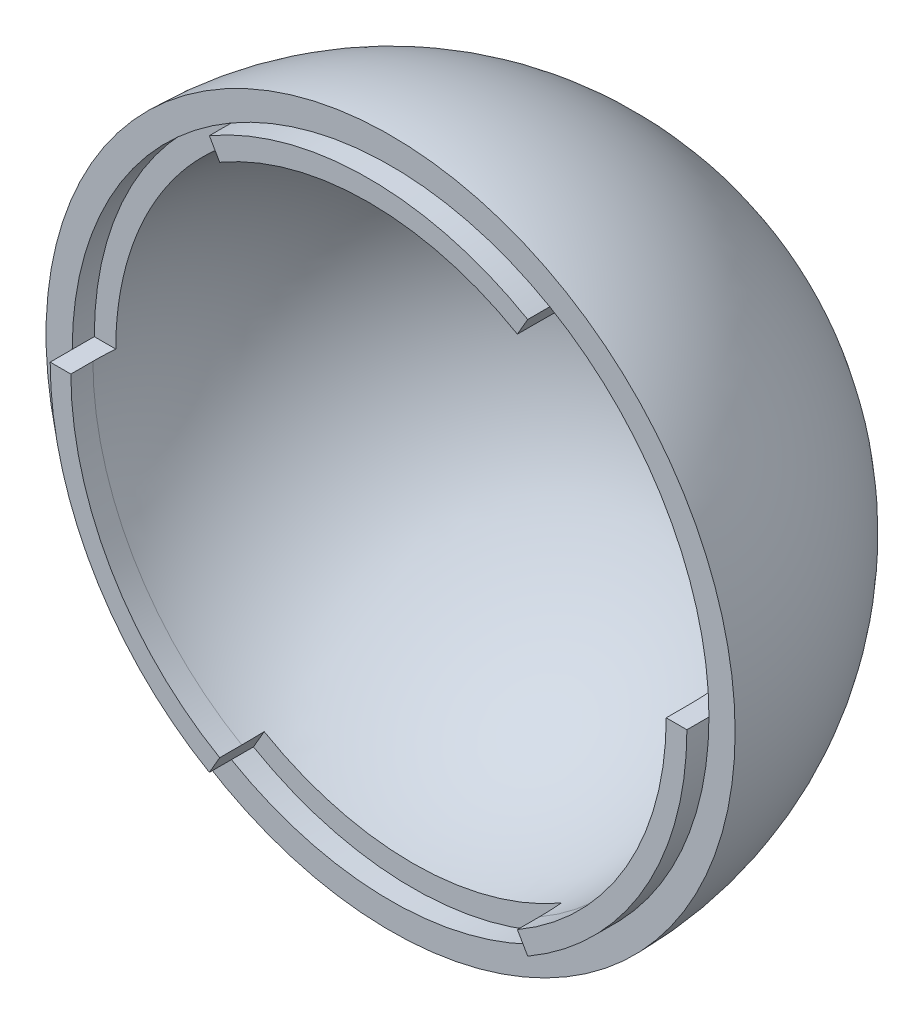
ISO-10303-21;
HEADER;
FILE_DESCRIPTION(('STEP AP214'),'2;1');
FILE_NAME('part.step','',(''),(''),'','','');
FILE_SCHEMA(('AUTOMOTIVE_DESIGN { 1 0 10303 214 1 1 1 1 }'));
ENDSEC;
DATA;
#1=APPLICATION_CONTEXT('core data for automotive mechanical design processes');
#2=APPLICATION_PROTOCOL_DEFINITION('international standard','automotive_design',2000,#1);
#3=PRODUCT_CONTEXT('',#1,'mechanical');
#4=PRODUCT('Part','Part','',(#3));
#5=PRODUCT_RELATED_PRODUCT_CATEGORY('part','',(#4));
#6=PRODUCT_DEFINITION_FORMATION('','',#4);
#7=PRODUCT_DEFINITION_CONTEXT('part definition',#1,'design');
#8=PRODUCT_DEFINITION('design','',#6,#7);
#9=PRODUCT_DEFINITION_SHAPE('','',#8);
#10=(LENGTH_UNIT() NAMED_UNIT(*) SI_UNIT(.MILLI.,.METRE.));
#11=(NAMED_UNIT(*) PLANE_ANGLE_UNIT() SI_UNIT($,.RADIAN.));
#12=(NAMED_UNIT(*) SI_UNIT($,.STERADIAN.) SOLID_ANGLE_UNIT());
#13=UNCERTAINTY_MEASURE_WITH_UNIT(LENGTH_MEASURE(1.E-05),#10,'distance_accuracy_value','');
#14=(GEOMETRIC_REPRESENTATION_CONTEXT(3) GLOBAL_UNCERTAINTY_ASSIGNED_CONTEXT((#13)) GLOBAL_UNIT_ASSIGNED_CONTEXT((#10,
#11,#12)) REPRESENTATION_CONTEXT('',''));
#15=CARTESIAN_POINT('',(0.,0.,0.));
#16=DIRECTION('',(0.,0.,1.));
#17=DIRECTION('',(1.,0.,0.));
#18=AXIS2_PLACEMENT_3D('',#15,#16,#17);
#19=CARTESIAN_POINT('',(0.,0.,0.));
#20=DIRECTION('',(0.,0.,-1.));
#21=DIRECTION('',(1.,0.,0.));
#22=AXIS2_PLACEMENT_3D('',#19,#20,#21);
#23=PLANE('',#22);
#24=CARTESIAN_POINT('',(0.,0.,0.));
#25=DIRECTION('',(0.,0.,-1.));
#26=DIRECTION('',(1.,0.,0.));
#27=AXIS2_PLACEMENT_3D('',#24,#25,#26);
#28=CIRCLE('',#27,125.);
#29=CARTESIAN_POINT('',(125.,0.,0.));
#30=VERTEX_POINT('',#29);
#31=EDGE_CURVE('E294',#30,#30,#28,.T.);
#32=ORIENTED_EDGE('',*,*,#31,.F.);
#33=EDGE_LOOP('',(#32));
#34=FACE_BOUND('',#33,.T.);
#35=CARTESIAN_POINT('',(0.,0.,0.));
#36=DIRECTION('',(0.,0.,1.));
#37=DIRECTION('',(-0.499999999999992,-0.866025403784443,0.));
#38=AXIS2_PLACEMENT_3D('',#35,#36,#37);
#39=CIRCLE('',#38,115.5);
#40=CARTESIAN_POINT('',(-115.5,-7.7715611723761E-13,-6.98477364880088E-13));
#41=VERTEX_POINT('',#40);
#42=CARTESIAN_POINT('',(-57.7500000000005,-100.025934137103,6.98477364880092E-13));
#43=VERTEX_POINT('',#42);
#44=EDGE_CURVE('E223',#41,#43,#39,.T.);
#45=ORIENTED_EDGE('',*,*,#44,.F.);
#46=CARTESIAN_POINT('',(0.,0.,0.));
#47=DIRECTION('',(0.,0.,1.));
#48=DIRECTION('',(-0.499999999999992,0.866025403784443,0.));
#49=AXIS2_PLACEMENT_3D('',#46,#47,#48);
#50=CIRCLE('',#49,115.5);
#51=CARTESIAN_POINT('',(-57.7499999999991,100.025934137103,-6.98477364880097E-13));
#52=VERTEX_POINT('',#51);
#53=EDGE_CURVE('E166',#52,#41,#50,.T.);
#54=ORIENTED_EDGE('',*,*,#53,.F.);
#55=CARTESIAN_POINT('',(0.,0.,0.));
#56=DIRECTION('',(0.,0.,1.));
#57=DIRECTION('',(-0.500000000000004,0.866025403784436,0.));
#58=AXIS2_PLACEMENT_3D('',#55,#56,#57);
#59=CIRCLE('',#58,115.5);
#60=CARTESIAN_POINT('',(57.7499999999998,100.025934137103,-1.39695472976019E-12));
#61=VERTEX_POINT('',#60);
#62=EDGE_CURVE('E247',#61,#52,#59,.T.);
#63=ORIENTED_EDGE('',*,*,#62,.F.);
#64=CARTESIAN_POINT('',(0.,0.,0.));
#65=DIRECTION('',(0.,0.,1.));
#66=DIRECTION('',(1.,0.,0.));
#67=AXIS2_PLACEMENT_3D('',#64,#65,#66);
#68=CIRCLE('',#67,115.5);
#69=CARTESIAN_POINT('',(115.5,0.,0.));
#70=VERTEX_POINT('',#69);
#71=EDGE_CURVE('E202',#70,#61,#68,.T.);
#72=ORIENTED_EDGE('',*,*,#71,.F.);
#73=CARTESIAN_POINT('',(0.,0.,0.));
#74=DIRECTION('',(0.,0.,1.));
#75=DIRECTION('',(1.,0.,0.));
#76=AXIS2_PLACEMENT_3D('',#73,#74,#75);
#77=CIRCLE('',#76,115.5);
#78=CARTESIAN_POINT('',(57.7499999999998,-100.025934137103,1.39695472976019E-12));
#79=VERTEX_POINT('',#78);
#80=EDGE_CURVE('E273',#79,#70,#77,.T.);
#81=ORIENTED_EDGE('',*,*,#80,.F.);
#82=CARTESIAN_POINT('',(0.,0.,0.));
#83=DIRECTION('',(0.,0.,1.));
#84=DIRECTION('',(-0.500000000000004,-0.866025403784436,0.));
#85=AXIS2_PLACEMENT_3D('',#82,#83,#84);
#86=CIRCLE('',#85,115.5);
#87=EDGE_CURVE('E187',#43,#79,#86,.T.);
#88=ORIENTED_EDGE('',*,*,#87,.F.);
#89=EDGE_LOOP('',(#45,#54,#63,#72,#81,#88));
#90=FACE_BOUND('',#89,.T.);
#91=ADVANCED_FACE('F33',(#34,#90),#23,.F.);
#92=CARTESIAN_POINT('',(0.,0.,0.));
#93=DIRECTION('',(1.,0.,0.));
#94=DIRECTION('',(0.,-1.,0.));
#95=AXIS2_PLACEMENT_3D('',#92,#93,#94);
#96=SPHERICAL_SURFACE('',#95,108.);
#97=CARTESIAN_POINT('',(0.,0.,0.));
#98=DIRECTION('',(0.866025403784443,0.499999999999992,0.));
#99=DIRECTION('',(-0.499999999999992,0.866025403784443,0.));
#100=AXIS2_PLACEMENT_3D('',#97,#98,#99);
#101=CIRCLE('',#100,108.);
#102=CARTESIAN_POINT('',(-53.8516480713442,93.2737905308885,-8.00000000000065));
#103=VERTEX_POINT('',#102);
#104=CARTESIAN_POINT('',(-53.9999999999991,93.5307436087199,-6.53121691835934E-13));
#105=VERTEX_POINT('',#104);
#106=EDGE_CURVE('E11',#103,#105,#101,.T.);
#107=ORIENTED_EDGE('',*,*,#106,.F.);
#108=CARTESIAN_POINT('',(0.,0.,-8.));
#109=DIRECTION('',(0.,0.,1.));
#110=DIRECTION('',(0.,-1.,0.));
#111=AXIS2_PLACEMENT_3D('',#108,#109,#110);
#112=CIRCLE('',#111,107.70329614269);
#113=CARTESIAN_POINT('',(-107.70329614269,6.63162493171745E-13,-7.99999999999935));
#114=VERTEX_POINT('',#113);
#115=EDGE_CURVE('E310',#103,#114,#112,.T.);
#116=ORIENTED_EDGE('',*,*,#115,.T.);
#117=CARTESIAN_POINT('',(0.,-3.41171535467311E-13,0.));
#118=DIRECTION('',(0.,-1.,0.));
#119=DIRECTION('',(0.,0.,-1.));
#120=AXIS2_PLACEMENT_3D('',#117,#118,#119);
#121=CIRCLE('',#120,108.);
#122=CARTESIAN_POINT('',(-108.,7.49955653134293E-13,6.53121691835926E-13));
#123=VERTEX_POINT('',#122);
#124=EDGE_CURVE('E41',#123,#114,#121,.T.);
#125=ORIENTED_EDGE('',*,*,#124,.F.);
#126=CARTESIAN_POINT('',(0.,0.,0.));
#127=DIRECTION('',(0.,0.,-1.));
#128=DIRECTION('',(-0.499999999999992,-0.866025403784443,0.));
#129=AXIS2_PLACEMENT_3D('',#126,#127,#128);
#130=CIRCLE('',#129,108.);
#131=CARTESIAN_POINT('',(-53.9999999999991,-93.5307436087199,6.53121691835934E-13));
#132=VERTEX_POINT('',#131);
#133=EDGE_CURVE('E216',#132,#123,#130,.T.);
#134=ORIENTED_EDGE('',*,*,#133,.F.);
#135=CARTESIAN_POINT('',(0.,0.,0.));
#136=DIRECTION('',(-0.866025403784436,0.500000000000004,0.));
#137=DIRECTION('',(-0.500000000000004,-0.866025403784436,0.));
#138=AXIS2_PLACEMENT_3D('',#135,#136,#137);
#139=CIRCLE('',#138,108.);
#140=CARTESIAN_POINT('',(-53.8516480713454,-93.273790530888,-7.99999999999935));
#141=VERTEX_POINT('',#140);
#142=EDGE_CURVE('E48',#141,#132,#139,.T.);
#143=ORIENTED_EDGE('',*,*,#142,.F.);
#144=CARTESIAN_POINT('',(0.,0.,-8.));
#145=DIRECTION('',(0.,0.,1.));
#146=DIRECTION('',(0.,-1.,0.));
#147=AXIS2_PLACEMENT_3D('',#144,#145,#146);
#148=CIRCLE('',#147,107.70329614269);
#149=CARTESIAN_POINT('',(53.8516480713449,-93.2737905308884,-7.9999999999987));
#150=VERTEX_POINT('',#149);
#151=EDGE_CURVE('E304',#141,#150,#148,.T.);
#152=ORIENTED_EDGE('',*,*,#151,.T.);
#153=CARTESIAN_POINT('',(3.00462919747433E-13,1.73472347597679E-13,0.));
#154=DIRECTION('',(0.866025403784441,0.499999999999995,0.));
#155=DIRECTION('',(-0.499999999999995,0.866025403784441,0.));
#156=AXIS2_PLACEMENT_3D('',#153,#154,#155);
#157=CIRCLE('',#156,108.);
#158=CARTESIAN_POINT('',(53.9999999999998,-93.5307436087195,1.30624338367186E-12));
#159=VERTEX_POINT('',#158);
#160=EDGE_CURVE('E307',#159,#150,#157,.T.);
#161=ORIENTED_EDGE('',*,*,#160,.F.);
#162=CARTESIAN_POINT('',(0.,0.,0.));
#163=DIRECTION('',(0.,0.,-1.));
#164=DIRECTION('',(1.,0.,0.));
#165=AXIS2_PLACEMENT_3D('',#162,#163,#164);
#166=CIRCLE('',#165,108.);
#167=CARTESIAN_POINT('',(108.,0.,0.));
#168=VERTEX_POINT('',#167);
#169=EDGE_CURVE('E269',#168,#159,#166,.T.);
#170=ORIENTED_EDGE('',*,*,#169,.F.);
#171=CARTESIAN_POINT('',(0.,0.,0.));
#172=DIRECTION('',(0.,-1.,0.));
#173=DIRECTION('',(0.,0.,-1.));
#174=AXIS2_PLACEMENT_3D('',#171,#172,#173);
#175=CIRCLE('',#174,108.);
#176=CARTESIAN_POINT('',(107.70329614269,0.,-8.));
#177=VERTEX_POINT('',#176);
#178=EDGE_CURVE('E302',#177,#168,#175,.T.);
#179=ORIENTED_EDGE('',*,*,#178,.F.);
#180=CARTESIAN_POINT('',(0.,0.,-8.));
#181=DIRECTION('',(0.,0.,1.));
#182=DIRECTION('',(1.,0.,0.));
#183=AXIS2_PLACEMENT_3D('',#180,#181,#182);
#184=CIRCLE('',#183,107.70329614269);
#185=CARTESIAN_POINT('',(53.8516480713448,93.2737905308883,-8.));
#186=VERTEX_POINT('',#185);
#187=EDGE_CURVE('E297',#177,#186,#184,.T.);
#188=ORIENTED_EDGE('',*,*,#187,.T.);
#189=CARTESIAN_POINT('',(-2.88444402957534E-13,1.66533453693774E-13,0.));
#190=DIRECTION('',(-0.866025403784438,0.500000000000001,0.));
#191=DIRECTION('',(-0.500000000000001,-0.866025403784438,0.));
#192=AXIS2_PLACEMENT_3D('',#189,#190,#191);
#193=CIRCLE('',#192,108.);
#194=CARTESIAN_POINT('',(53.9999999999998,93.5307436087195,0.));
#195=VERTEX_POINT('',#194);
#196=EDGE_CURVE('E300',#195,#186,#193,.T.);
#197=ORIENTED_EDGE('',*,*,#196,.F.);
#198=CARTESIAN_POINT('',(0.,0.,0.));
#199=DIRECTION('',(0.,0.,-1.));
#200=DIRECTION('',(-0.500000000000004,0.866025403784436,0.));
#201=AXIS2_PLACEMENT_3D('',#198,#199,#200);
#202=CIRCLE('',#201,108.);
#203=EDGE_CURVE('E242',#105,#195,#202,.T.);
#204=ORIENTED_EDGE('',*,*,#203,.F.);
#205=EDGE_LOOP('',(#107,#116,#125,#134,#143,#152,#161,#170,#179,#188,#197,#204));
#206=FACE_BOUND('',#205,.T.);
#207=ADVANCED_FACE('F313',(#206),#96,.F.);
#208=CARTESIAN_POINT('',(0.,0.,0.));
#209=DIRECTION('',(1.,0.,0.));
#210=DIRECTION('',(0.,1.,0.));
#211=AXIS2_PLACEMENT_3D('',#208,#209,#210);
#212=SPHERICAL_SURFACE('',#211,125.);
#213=CARTESIAN_POINT('',(0.,0.,0.));
#214=DIRECTION('',(0.,0.,-1.));
#215=DIRECTION('',(1.,0.,0.));
#216=AXIS2_PLACEMENT_3D('',#213,#214,#215);
#217=SPHERICAL_SURFACE('',#216,125.);
#218=ORIENTED_EDGE('',*,*,#31,.T.);
#219=EDGE_LOOP('',(#218));
#220=FACE_BOUND('',#219,.T.);
#221=ADVANCED_FACE('F35',(#220),#217,.T.);
#222=CARTESIAN_POINT('',(0.,0.,8.));
#223=DIRECTION('',(0.,0.,-1.));
#224=DIRECTION('',(-1.,0.,0.));
#225=AXIS2_PLACEMENT_3D('',#222,#223,#224);
#226=CYLINDRICAL_SURFACE('',#225,108.);
#227=ORIENTED_EDGE('',*,*,#169,.T.);
#228=DIRECTION('',(0.,0.,-1.));
#229=VECTOR('',#228,1.);
#230=CARTESIAN_POINT('',(53.9999999999998,-93.5307436087195,8.));
#231=LINE('',#230,#229);
#232=CARTESIAN_POINT('',(53.9999999999998,-93.5307436087195,8.));
#233=VERTEX_POINT('',#232);
#234=EDGE_CURVE('E291',#233,#159,#231,.T.);
#235=ORIENTED_EDGE('',*,*,#234,.F.);
#236=CARTESIAN_POINT('',(0.,0.,8.));
#237=DIRECTION('',(0.,0.,-1.));
#238=DIRECTION('',(1.,0.,0.));
#239=AXIS2_PLACEMENT_3D('',#236,#237,#238);
#240=CIRCLE('',#239,108.);
#241=CARTESIAN_POINT('',(108.,0.,8.));
#242=VERTEX_POINT('',#241);
#243=EDGE_CURVE('E270',#242,#233,#240,.T.);
#244=ORIENTED_EDGE('',*,*,#243,.F.);
#245=DIRECTION('',(0.,0.,-1.));
#246=VECTOR('',#245,1.);
#247=CARTESIAN_POINT('',(108.,0.,8.));
#248=LINE('',#247,#246);
#249=EDGE_CURVE('E278',#242,#168,#248,.T.);
#250=ORIENTED_EDGE('',*,*,#249,.T.);
#251=EDGE_LOOP('',(#227,#235,#244,#250));
#252=FACE_BOUND('',#251,.T.);
#253=ADVANCED_FACE('F351',(#252),#226,.F.);
#254=CARTESIAN_POINT('',(53.9999999999998,-93.5307436087195,8.));
#255=DIRECTION('',(0.866025403784439,0.499999999999999,0.));
#256=DIRECTION('',(-0.499999999999999,0.866025403784439,0.));
#257=AXIS2_PLACEMENT_3D('',#254,#255,#256);
#258=PLANE('',#257);
#259=ORIENTED_EDGE('',*,*,#234,.T.);
#260=ORIENTED_EDGE('',*,*,#160,.T.);
#261=DIRECTION('',(-0.499999999999995,0.866025403784441,0.));
#262=VECTOR('',#261,1.);
#263=CARTESIAN_POINT('',(57.7499999999998,-100.025934137103,-7.9999999999986));
#264=LINE('',#263,#262);
#265=CARTESIAN_POINT('',(57.7499999999998,-100.025934137103,-7.9999999999986));
#266=VERTEX_POINT('',#265);
#267=EDGE_CURVE('E192',#266,#150,#264,.T.);
#268=ORIENTED_EDGE('',*,*,#267,.F.);
#269=DIRECTION('',(0.,0.,1.));
#270=VECTOR('',#269,1.);
#271=CARTESIAN_POINT('',(57.7499999999998,-100.025934137103,-7.9999999999986));
#272=LINE('',#271,#270);
#273=EDGE_CURVE('E197',#266,#79,#272,.T.);
#274=ORIENTED_EDGE('',*,*,#273,.T.);
#275=DIRECTION('',(0.,0.,-1.));
#276=VECTOR('',#275,1.);
#277=CARTESIAN_POINT('',(57.7499999999997,-100.025934137103,8.));
#278=LINE('',#277,#276);
#279=CARTESIAN_POINT('',(57.7499999999997,-100.025934137103,8.));
#280=VERTEX_POINT('',#279);
#281=EDGE_CURVE('E288',#280,#79,#278,.T.);
#282=ORIENTED_EDGE('',*,*,#281,.F.);
#283=DIRECTION('',(0.499999999999999,-0.866025403784439,0.));
#284=VECTOR('',#283,1.);
#285=CARTESIAN_POINT('',(53.9999999999998,-93.5307436087195,8.));
#286=LINE('',#285,#284);
#287=EDGE_CURVE('E272',#233,#280,#286,.T.);
#288=ORIENTED_EDGE('',*,*,#287,.F.);
#289=EDGE_LOOP('',(#259,#260,#268,#274,#282,#288));
#290=FACE_BOUND('',#289,.T.);
#291=ADVANCED_FACE('F354',(#290),#258,.F.);
#292=CARTESIAN_POINT('',(0.,0.,8.));
#293=DIRECTION('',(0.,0.,-1.));
#294=DIRECTION('',(-1.,0.,0.));
#295=AXIS2_PLACEMENT_3D('',#292,#293,#294);
#296=CYLINDRICAL_SURFACE('',#295,115.5);
#297=ORIENTED_EDGE('',*,*,#80,.T.);
#298=DIRECTION('',(0.,0.,-1.));
#299=VECTOR('',#298,1.);
#300=CARTESIAN_POINT('',(115.5,0.,8.));
#301=LINE('',#300,#299);
#302=CARTESIAN_POINT('',(115.5,0.,8.));
#303=VERTEX_POINT('',#302);
#304=EDGE_CURVE('E285',#303,#70,#301,.T.);
#305=ORIENTED_EDGE('',*,*,#304,.F.);
#306=CARTESIAN_POINT('',(0.,0.,8.));
#307=DIRECTION('',(0.,0.,1.));
#308=DIRECTION('',(1.,0.,0.));
#309=AXIS2_PLACEMENT_3D('',#306,#307,#308);
#310=CIRCLE('',#309,115.5);
#311=EDGE_CURVE('E275',#280,#303,#310,.T.);
#312=ORIENTED_EDGE('',*,*,#311,.F.);
#313=ORIENTED_EDGE('',*,*,#281,.T.);
#314=EDGE_LOOP('',(#297,#305,#312,#313));
#315=FACE_BOUND('',#314,.T.);
#316=ADVANCED_FACE('F340',(#315),#296,.T.);
#317=CARTESIAN_POINT('',(108.,0.,8.));
#318=DIRECTION('',(0.,-1.,0.));
#319=DIRECTION('',(0.,0.,-1.));
#320=AXIS2_PLACEMENT_3D('',#317,#318,#319);
#321=PLANE('',#320);
#322=ORIENTED_EDGE('',*,*,#304,.T.);
#323=DIRECTION('',(0.,0.,1.));
#324=VECTOR('',#323,1.);
#325=CARTESIAN_POINT('',(115.5,0.,-8.));
#326=LINE('',#325,#324);
#327=CARTESIAN_POINT('',(115.5,0.,-8.));
#328=VERTEX_POINT('',#327);
#329=EDGE_CURVE('E214',#328,#70,#326,.T.);
#330=ORIENTED_EDGE('',*,*,#329,.F.);
#331=DIRECTION('',(1.,0.,0.));
#332=VECTOR('',#331,1.);
#333=CARTESIAN_POINT('',(100.721513973529,0.,-8.));
#334=LINE('',#333,#332);
#335=EDGE_CURVE('E210',#177,#328,#334,.T.);
#336=ORIENTED_EDGE('',*,*,#335,.F.);
#337=ORIENTED_EDGE('',*,*,#178,.T.);
#338=ORIENTED_EDGE('',*,*,#249,.F.);
#339=DIRECTION('',(-1.,0.,0.));
#340=VECTOR('',#339,1.);
#341=CARTESIAN_POINT('',(108.,0.,8.));
#342=LINE('',#341,#340);
#343=EDGE_CURVE('E56',#303,#242,#342,.T.);
#344=ORIENTED_EDGE('',*,*,#343,.F.);
#345=EDGE_LOOP('',(#322,#330,#336,#337,#338,#344));
#346=FACE_BOUND('',#345,.T.);
#347=ADVANCED_FACE('F344',(#346),#321,.F.);
#348=CARTESIAN_POINT('',(0.,0.,8.));
#349=DIRECTION('',(0.,0.,1.));
#350=DIRECTION('',(1.,0.,0.));
#351=AXIS2_PLACEMENT_3D('',#348,#349,#350);
#352=PLANE('',#351);
#353=ORIENTED_EDGE('',*,*,#243,.T.);
#354=ORIENTED_EDGE('',*,*,#287,.T.);
#355=ORIENTED_EDGE('',*,*,#311,.T.);
#356=ORIENTED_EDGE('',*,*,#343,.T.);
#357=EDGE_LOOP('',(#353,#354,#355,#356));
#358=FACE_BOUND('',#357,.T.);
#359=ADVANCED_FACE('F352',(#358),#352,.T.);
#360=CARTESIAN_POINT('',(0.,0.,8.));
#361=DIRECTION('',(0.,0.,-1.));
#362=DIRECTION('',(0.,1.,0.));
#363=AXIS2_PLACEMENT_3D('',#360,#361,#362);
#364=CYLINDRICAL_SURFACE('',#363,108.);
#365=ORIENTED_EDGE('',*,*,#203,.T.);
#366=DIRECTION('',(0.,0.,-1.));
#367=VECTOR('',#366,1.);
#368=CARTESIAN_POINT('',(53.9999999999998,93.5307436087196,7.99999999999869));
#369=LINE('',#368,#367);
#370=CARTESIAN_POINT('',(53.9999999999998,93.5307436087196,7.99999999999869));
#371=VERTEX_POINT('',#370);
#372=EDGE_CURVE('E266',#371,#195,#369,.T.);
#373=ORIENTED_EDGE('',*,*,#372,.F.);
#374=CARTESIAN_POINT('',(0.,0.,8.));
#375=DIRECTION('',(0.,0.,-1.));
#376=DIRECTION('',(-0.500000000000004,0.866025403784436,0.));
#377=AXIS2_PLACEMENT_3D('',#374,#375,#376);
#378=CIRCLE('',#377,108.);
#379=CARTESIAN_POINT('',(-54.0000000000004,93.5307436087192,7.99999999999935));
#380=VERTEX_POINT('',#379);
#381=EDGE_CURVE('E243',#380,#371,#378,.T.);
#382=ORIENTED_EDGE('',*,*,#381,.F.);
#383=DIRECTION('',(0.,0.,-1.));
#384=VECTOR('',#383,1.);
#385=CARTESIAN_POINT('',(-54.0000000000004,93.5307436087192,7.99999999999935));
#386=LINE('',#385,#384);
#387=EDGE_CURVE('E253',#380,#105,#386,.T.);
#388=ORIENTED_EDGE('',*,*,#387,.T.);
#389=EDGE_LOOP('',(#365,#373,#382,#388));
#390=FACE_BOUND('',#389,.T.);
#391=ADVANCED_FACE('F401',(#390),#364,.F.);
#392=CARTESIAN_POINT('',(53.9999999999998,93.5307436087196,7.99999999999869));
#393=DIRECTION('',(-0.86602540378444,0.499999999999997,0.));
#394=DIRECTION('',(-0.499999999999997,-0.86602540378444,0.));
#395=AXIS2_PLACEMENT_3D('',#392,#393,#394);
#396=PLANE('',#395);
#397=ORIENTED_EDGE('',*,*,#372,.T.);
#398=ORIENTED_EDGE('',*,*,#196,.T.);
#399=DIRECTION('',(-0.500000000000001,-0.866025403784438,0.));
#400=VECTOR('',#399,1.);
#401=CARTESIAN_POINT('',(57.7499999999998,100.025934137103,-8.));
#402=LINE('',#401,#400);
#403=CARTESIAN_POINT('',(57.7499999999998,100.025934137103,-8.));
#404=VERTEX_POINT('',#403);
#405=EDGE_CURVE('E207',#404,#186,#402,.T.);
#406=ORIENTED_EDGE('',*,*,#405,.F.);
#407=DIRECTION('',(0.,0.,1.));
#408=VECTOR('',#407,1.);
#409=CARTESIAN_POINT('',(57.7499999999998,100.025934137103,-8.));
#410=LINE('',#409,#408);
#411=EDGE_CURVE('E212',#404,#61,#410,.T.);
#412=ORIENTED_EDGE('',*,*,#411,.T.);
#413=DIRECTION('',(0.,0.,-1.));
#414=VECTOR('',#413,1.);
#415=CARTESIAN_POINT('',(57.7499999999998,100.025934137103,7.9999999999986));
#416=LINE('',#415,#414);
#417=CARTESIAN_POINT('',(57.7499999999998,100.025934137103,7.9999999999986));
#418=VERTEX_POINT('',#417);
#419=EDGE_CURVE('E263',#418,#61,#416,.T.);
#420=ORIENTED_EDGE('',*,*,#419,.F.);
#421=DIRECTION('',(0.499999999999997,0.86602540378444,0.));
#422=VECTOR('',#421,1.);
#423=CARTESIAN_POINT('',(53.9999999999998,93.5307436087196,7.99999999999869));
#424=LINE('',#423,#422);
#425=EDGE_CURVE('E246',#371,#418,#424,.T.);
#426=ORIENTED_EDGE('',*,*,#425,.F.);
#427=EDGE_LOOP('',(#397,#398,#406,#412,#420,#426));
#428=FACE_BOUND('',#427,.T.);
#429=ADVANCED_FACE('F331',(#428),#396,.F.);
#430=CARTESIAN_POINT('',(0.,0.,8.));
#431=DIRECTION('',(0.,0.,-1.));
#432=DIRECTION('',(0.,1.,0.));
#433=AXIS2_PLACEMENT_3D('',#430,#431,#432);
#434=CYLINDRICAL_SURFACE('',#433,115.5);
#435=ORIENTED_EDGE('',*,*,#62,.T.);
#436=DIRECTION('',(0.,0.,-1.));
#437=VECTOR('',#436,1.);
#438=CARTESIAN_POINT('',(-57.7500000000004,100.025934137103,7.9999999999993));
#439=LINE('',#438,#437);
#440=CARTESIAN_POINT('',(-57.7500000000004,100.025934137103,7.9999999999993));
#441=VERTEX_POINT('',#440);
#442=EDGE_CURVE('E260',#441,#52,#439,.T.);
#443=ORIENTED_EDGE('',*,*,#442,.F.);
#444=CARTESIAN_POINT('',(0.,0.,8.));
#445=DIRECTION('',(0.,0.,1.));
#446=DIRECTION('',(-0.500000000000004,0.866025403784436,0.));
#447=AXIS2_PLACEMENT_3D('',#444,#445,#446);
#448=CIRCLE('',#447,115.5);
#449=EDGE_CURVE('E249',#418,#441,#448,.T.);
#450=ORIENTED_EDGE('',*,*,#449,.F.);
#451=ORIENTED_EDGE('',*,*,#419,.T.);
#452=EDGE_LOOP('',(#435,#443,#450,#451));
#453=FACE_BOUND('',#452,.T.);
#454=ADVANCED_FACE('F327',(#453),#434,.T.);
#455=CARTESIAN_POINT('',(-54.0000000000004,93.5307436087192,7.99999999999935));
#456=DIRECTION('',(0.866025403784436,0.500000000000004,0.));
#457=DIRECTION('',(-0.500000000000004,0.866025403784436,0.));
#458=AXIS2_PLACEMENT_3D('',#455,#456,#457);
#459=PLANE('',#458);
#460=ORIENTED_EDGE('',*,*,#442,.T.);
#461=DIRECTION('',(0.,0.,1.));
#462=VECTOR('',#461,1.);
#463=CARTESIAN_POINT('',(-57.7499999999992,100.025934137103,-8.0000000000007));
#464=LINE('',#463,#462);
#465=CARTESIAN_POINT('',(-57.7499999999992,100.025934137103,-8.0000000000007));
#466=VERTEX_POINT('',#465);
#467=EDGE_CURVE('E170',#466,#52,#464,.T.);
#468=ORIENTED_EDGE('',*,*,#467,.F.);
#469=DIRECTION('',(-0.499999999999992,0.866025403784443,0.));
#470=VECTOR('',#469,1.);
#471=CARTESIAN_POINT('',(-50.3607569867636,87.2273898087056,-8.00000000000061));
#472=LINE('',#471,#470);
#473=EDGE_CURVE('E171',#103,#466,#472,.T.);
#474=ORIENTED_EDGE('',*,*,#473,.F.);
#475=ORIENTED_EDGE('',*,*,#106,.T.);
#476=ORIENTED_EDGE('',*,*,#387,.F.);
#477=DIRECTION('',(0.500000000000004,-0.866025403784436,0.));
#478=VECTOR('',#477,1.);
#479=CARTESIAN_POINT('',(-54.0000000000004,93.5307436087192,7.99999999999935));
#480=LINE('',#479,#478);
#481=EDGE_CURVE('E251',#441,#380,#480,.T.);
#482=ORIENTED_EDGE('',*,*,#481,.F.);
#483=EDGE_LOOP('',(#460,#468,#474,#475,#476,#482));
#484=FACE_BOUND('',#483,.T.);
#485=ADVANCED_FACE('F317',(#484),#459,.F.);
#486=CARTESIAN_POINT('',(0.,0.,8.));
#487=DIRECTION('',(0.,0.,1.));
#488=DIRECTION('',(-0.500000000000004,0.866025403784436,0.));
#489=AXIS2_PLACEMENT_3D('',#486,#487,#488);
#490=PLANE('',#489);
#491=ORIENTED_EDGE('',*,*,#381,.T.);
#492=ORIENTED_EDGE('',*,*,#425,.T.);
#493=ORIENTED_EDGE('',*,*,#449,.T.);
#494=ORIENTED_EDGE('',*,*,#481,.T.);
#495=EDGE_LOOP('',(#491,#492,#493,#494));
#496=FACE_BOUND('',#495,.T.);
#497=ADVANCED_FACE('F411',(#496),#490,.T.);
#498=CARTESIAN_POINT('',(0.,0.,8.));
#499=DIRECTION('',(0.,0.,-1.));
#500=DIRECTION('',(0.,1.,0.));
#501=AXIS2_PLACEMENT_3D('',#498,#499,#500);
#502=CYLINDRICAL_SURFACE('',#501,108.);
#503=ORIENTED_EDGE('',*,*,#133,.T.);
#504=DIRECTION('',(0.,0.,-1.));
#505=VECTOR('',#504,1.);
#506=CARTESIAN_POINT('',(-108.,-6.72543883393653E-13,7.99999999999935));
#507=LINE('',#506,#505);
#508=CARTESIAN_POINT('',(-108.,-6.72543883393653E-13,7.99999999999935));
#509=VERTEX_POINT('',#508);
#510=EDGE_CURVE('E240',#509,#123,#507,.T.);
#511=ORIENTED_EDGE('',*,*,#510,.F.);
#512=CARTESIAN_POINT('',(0.,0.,8.));
#513=DIRECTION('',(0.,0.,-1.));
#514=DIRECTION('',(-0.499999999999992,-0.866025403784443,0.));
#515=AXIS2_PLACEMENT_3D('',#512,#513,#514);
#516=CIRCLE('',#515,108.);
#517=CARTESIAN_POINT('',(-53.9999999999992,-93.5307436087198,8.00000000000065));
#518=VERTEX_POINT('',#517);
#519=EDGE_CURVE('E219',#518,#509,#516,.T.);
#520=ORIENTED_EDGE('',*,*,#519,.F.);
#521=DIRECTION('',(0.,0.,-1.));
#522=VECTOR('',#521,1.);
#523=CARTESIAN_POINT('',(-53.9999999999992,-93.5307436087198,8.00000000000065));
#524=LINE('',#523,#522);
#525=EDGE_CURVE('E229',#518,#132,#524,.T.);
#526=ORIENTED_EDGE('',*,*,#525,.T.);
#527=EDGE_LOOP('',(#503,#511,#520,#526));
#528=FACE_BOUND('',#527,.T.);
#529=ADVANCED_FACE('F371',(#528),#502,.F.);
#530=CARTESIAN_POINT('',(-108.,-6.72543883393653E-13,7.99999999999935));
#531=DIRECTION('',(0.,-1.,0.));
#532=DIRECTION('',(0.,0.,-1.));
#533=AXIS2_PLACEMENT_3D('',#530,#531,#532);
#534=PLANE('',#533);
#535=ORIENTED_EDGE('',*,*,#510,.T.);
#536=ORIENTED_EDGE('',*,*,#124,.T.);
#537=DIRECTION('',(1.,0.,0.));
#538=VECTOR('',#537,1.);
#539=CARTESIAN_POINT('',(-115.5,7.41932822432725E-13,-7.9999999999993));
#540=LINE('',#539,#538);
#541=CARTESIAN_POINT('',(-115.5,7.41932822432725E-13,-7.9999999999993));
#542=VERTEX_POINT('',#541);
#543=EDGE_CURVE('E174',#542,#114,#540,.T.);
#544=ORIENTED_EDGE('',*,*,#543,.F.);
#545=DIRECTION('',(0.,0.,1.));
#546=VECTOR('',#545,1.);
#547=CARTESIAN_POINT('',(-115.5,7.41932822432725E-13,-7.9999999999993));
#548=LINE('',#547,#546);
#549=EDGE_CURVE('E160',#542,#41,#548,.T.);
#550=ORIENTED_EDGE('',*,*,#549,.T.);
#551=DIRECTION('',(0.,0.,-1.));
#552=VECTOR('',#551,1.);
#553=CARTESIAN_POINT('',(-115.5,-6.93360565105375E-13,7.9999999999993));
#554=LINE('',#553,#552);
#555=CARTESIAN_POINT('',(-115.5,-6.93360565105375E-13,7.9999999999993));
#556=VERTEX_POINT('',#555);
#557=EDGE_CURVE('E238',#556,#41,#554,.T.);
#558=ORIENTED_EDGE('',*,*,#557,.F.);
#559=DIRECTION('',(-1.,0.,0.));
#560=VECTOR('',#559,1.);
#561=CARTESIAN_POINT('',(-108.,-6.72543883393653E-13,7.99999999999935));
#562=LINE('',#561,#560);
#563=EDGE_CURVE('E222',#509,#556,#562,.T.);
#564=ORIENTED_EDGE('',*,*,#563,.F.);
#565=EDGE_LOOP('',(#535,#536,#544,#550,#558,#564));
#566=FACE_BOUND('',#565,.T.);
#567=ADVANCED_FACE('F176',(#566),#534,.F.);
#568=CARTESIAN_POINT('',(0.,0.,8.));
#569=DIRECTION('',(0.,0.,-1.));
#570=DIRECTION('',(0.,1.,0.));
#571=AXIS2_PLACEMENT_3D('',#568,#569,#570);
#572=CYLINDRICAL_SURFACE('',#571,115.5);
#573=ORIENTED_EDGE('',*,*,#44,.T.);
#574=DIRECTION('',(0.,0.,-1.));
#575=VECTOR('',#574,1.);
#576=CARTESIAN_POINT('',(-57.7499999999991,-100.025934137103,8.0000000000007));
#577=LINE('',#576,#575);
#578=CARTESIAN_POINT('',(-57.7499999999991,-100.025934137103,8.0000000000007));
#579=VERTEX_POINT('',#578);
#580=EDGE_CURVE('E235',#579,#43,#577,.T.);
#581=ORIENTED_EDGE('',*,*,#580,.F.);
#582=CARTESIAN_POINT('',(0.,0.,8.));
#583=DIRECTION('',(0.,0.,1.));
#584=DIRECTION('',(-0.499999999999992,-0.866025403784443,0.));
#585=AXIS2_PLACEMENT_3D('',#582,#583,#584);
#586=CIRCLE('',#585,115.5);
#587=EDGE_CURVE('E225',#556,#579,#586,.T.);
#588=ORIENTED_EDGE('',*,*,#587,.F.);
#589=ORIENTED_EDGE('',*,*,#557,.T.);
#590=EDGE_LOOP('',(#573,#581,#588,#589));
#591=FACE_BOUND('',#590,.T.);
#592=ADVANCED_FACE('F362',(#591),#572,.T.);
#593=CARTESIAN_POINT('',(-53.9999999999992,-93.5307436087198,8.00000000000065));
#594=DIRECTION('',(-0.866025403784443,0.499999999999992,0.));
#595=DIRECTION('',(-0.499999999999992,-0.866025403784443,0.));
#596=AXIS2_PLACEMENT_3D('',#593,#594,#595);
#597=PLANE('',#596);
#598=ORIENTED_EDGE('',*,*,#580,.T.);
#599=DIRECTION('',(0.,0.,1.));
#600=VECTOR('',#599,1.);
#601=CARTESIAN_POINT('',(-57.7500000000005,-100.025934137103,-7.9999999999993));
#602=LINE('',#601,#600);
#603=CARTESIAN_POINT('',(-57.7500000000005,-100.025934137103,-7.9999999999993));
#604=VERTEX_POINT('',#603);
#605=EDGE_CURVE('E200',#604,#43,#602,.T.);
#606=ORIENTED_EDGE('',*,*,#605,.F.);
#607=DIRECTION('',(-0.500000000000004,-0.866025403784436,0.));
#608=VECTOR('',#607,1.);
#609=CARTESIAN_POINT('',(-50.3607569867647,-87.2273898087051,-7.99999999999939));
#610=LINE('',#609,#608);
#611=EDGE_CURVE('E195',#141,#604,#610,.T.);
#612=ORIENTED_EDGE('',*,*,#611,.F.);
#613=ORIENTED_EDGE('',*,*,#142,.T.);
#614=ORIENTED_EDGE('',*,*,#525,.F.);
#615=DIRECTION('',(0.499999999999992,0.866025403784443,0.));
#616=VECTOR('',#615,1.);
#617=CARTESIAN_POINT('',(-53.9999999999992,-93.5307436087198,8.00000000000065));
#618=LINE('',#617,#616);
#619=EDGE_CURVE('E227',#579,#518,#618,.T.);
#620=ORIENTED_EDGE('',*,*,#619,.F.);
#621=EDGE_LOOP('',(#598,#606,#612,#613,#614,#620));
#622=FACE_BOUND('',#621,.T.);
#623=ADVANCED_FACE('F365',(#622),#597,.F.);
#624=CARTESIAN_POINT('',(0.,0.,8.));
#625=DIRECTION('',(0.,0.,1.));
#626=DIRECTION('',(-0.499999999999992,-0.866025403784443,0.));
#627=AXIS2_PLACEMENT_3D('',#624,#625,#626);
#628=PLANE('',#627);
#629=ORIENTED_EDGE('',*,*,#519,.T.);
#630=ORIENTED_EDGE('',*,*,#563,.T.);
#631=ORIENTED_EDGE('',*,*,#587,.T.);
#632=ORIENTED_EDGE('',*,*,#619,.T.);
#633=EDGE_LOOP('',(#629,#630,#631,#632));
#634=FACE_BOUND('',#633,.T.);
#635=ADVANCED_FACE('F368',(#634),#628,.T.);
#636=CARTESIAN_POINT('',(0.,0.,-8.));
#637=DIRECTION('',(0.,0.,1.));
#638=DIRECTION('',(1.,0.,0.));
#639=AXIS2_PLACEMENT_3D('',#636,#637,#638);
#640=CYLINDRICAL_SURFACE('',#639,115.5);
#641=ORIENTED_EDGE('',*,*,#71,.T.);
#642=ORIENTED_EDGE('',*,*,#411,.F.);
#643=CARTESIAN_POINT('',(0.,0.,-8.));
#644=DIRECTION('',(0.,0.,1.));
#645=DIRECTION('',(1.,0.,0.));
#646=AXIS2_PLACEMENT_3D('',#643,#644,#645);
#647=CIRCLE('',#646,115.5);
#648=EDGE_CURVE('E204',#328,#404,#647,.T.);
#649=ORIENTED_EDGE('',*,*,#648,.F.);
#650=ORIENTED_EDGE('',*,*,#329,.T.);
#651=EDGE_LOOP('',(#641,#642,#649,#650));
#652=FACE_BOUND('',#651,.T.);
#653=ADVANCED_FACE('F335',(#652),#640,.F.);
#654=CARTESIAN_POINT('',(0.,0.,-8.));
#655=DIRECTION('',(0.,0.,1.));
#656=DIRECTION('',(1.,0.,0.));
#657=AXIS2_PLACEMENT_3D('',#654,#655,#656);
#658=PLANE('',#657);
#659=ORIENTED_EDGE('',*,*,#335,.T.);
#660=ORIENTED_EDGE('',*,*,#648,.T.);
#661=ORIENTED_EDGE('',*,*,#405,.T.);
#662=ORIENTED_EDGE('',*,*,#187,.F.);
#663=EDGE_LOOP('',(#659,#660,#661,#662));
#664=FACE_BOUND('',#663,.T.);
#665=ADVANCED_FACE('F381',(#664),#658,.T.);
#666=CARTESIAN_POINT('',(0.,0.,-8.));
#667=DIRECTION('',(0.,0.,1.));
#668=DIRECTION('',(0.,-1.,0.));
#669=AXIS2_PLACEMENT_3D('',#666,#667,#668);
#670=CYLINDRICAL_SURFACE('',#669,115.5);
#671=ORIENTED_EDGE('',*,*,#87,.T.);
#672=ORIENTED_EDGE('',*,*,#273,.F.);
#673=CARTESIAN_POINT('',(0.,0.,-8.));
#674=DIRECTION('',(0.,0.,1.));
#675=DIRECTION('',(-0.500000000000004,-0.866025403784436,0.));
#676=AXIS2_PLACEMENT_3D('',#673,#674,#675);
#677=CIRCLE('',#676,115.5);
#678=EDGE_CURVE('E189',#604,#266,#677,.T.);
#679=ORIENTED_EDGE('',*,*,#678,.F.);
#680=ORIENTED_EDGE('',*,*,#605,.T.);
#681=EDGE_LOOP('',(#671,#672,#679,#680));
#682=FACE_BOUND('',#681,.T.);
#683=ADVANCED_FACE('F358',(#682),#670,.F.);
#684=CARTESIAN_POINT('',(0.,0.,-8.));
#685=DIRECTION('',(0.,0.,1.));
#686=DIRECTION('',(-0.500000000000004,-0.866025403784436,0.));
#687=AXIS2_PLACEMENT_3D('',#684,#685,#686);
#688=PLANE('',#687);
#689=ORIENTED_EDGE('',*,*,#611,.T.);
#690=ORIENTED_EDGE('',*,*,#678,.T.);
#691=ORIENTED_EDGE('',*,*,#267,.T.);
#692=ORIENTED_EDGE('',*,*,#151,.F.);
#693=EDGE_LOOP('',(#689,#690,#691,#692));
#694=FACE_BOUND('',#693,.T.);
#695=ADVANCED_FACE('F373',(#694),#688,.T.);
#696=CARTESIAN_POINT('',(0.,0.,-8.));
#697=DIRECTION('',(0.,0.,1.));
#698=DIRECTION('',(0.,-1.,0.));
#699=AXIS2_PLACEMENT_3D('',#696,#697,#698);
#700=CYLINDRICAL_SURFACE('',#699,115.5);
#701=ORIENTED_EDGE('',*,*,#53,.T.);
#702=ORIENTED_EDGE('',*,*,#549,.F.);
#703=CARTESIAN_POINT('',(0.,0.,-8.));
#704=DIRECTION('',(0.,0.,1.));
#705=DIRECTION('',(-0.499999999999992,0.866025403784443,0.));
#706=AXIS2_PLACEMENT_3D('',#703,#704,#705);
#707=CIRCLE('',#706,115.5);
#708=EDGE_CURVE('E164',#466,#542,#707,.T.);
#709=ORIENTED_EDGE('',*,*,#708,.F.);
#710=ORIENTED_EDGE('',*,*,#467,.T.);
#711=EDGE_LOOP('',(#701,#702,#709,#710));
#712=FACE_BOUND('',#711,.T.);
#713=ADVANCED_FACE('F162',(#712),#700,.F.);
#714=CARTESIAN_POINT('',(0.,0.,-8.));
#715=DIRECTION('',(0.,0.,1.));
#716=DIRECTION('',(-0.499999999999992,0.866025403784443,0.));
#717=AXIS2_PLACEMENT_3D('',#714,#715,#716);
#718=PLANE('',#717);
#719=ORIENTED_EDGE('',*,*,#473,.T.);
#720=ORIENTED_EDGE('',*,*,#708,.T.);
#721=ORIENTED_EDGE('',*,*,#543,.T.);
#722=ORIENTED_EDGE('',*,*,#115,.F.);
#723=EDGE_LOOP('',(#719,#720,#721,#722));
#724=FACE_BOUND('',#723,.T.);
#725=ADVANCED_FACE('F180',(#724),#718,.T.);
#726=CLOSED_SHELL('',(#91,#207,#221,#253,#291,#316,#347,#359,#391,#429,#454,#485,#497,#529,#567,
#592,#623,#635,#653,#665,#683,#695,#713,#725));
#727=MANIFOLD_SOLID_BREP('B2',#726);
#728=ADVANCED_BREP_SHAPE_REPRESENTATION('',(#18,#727),#14);
#729=SHAPE_DEFINITION_REPRESENTATION(#9,#728);
ENDSEC;
END-ISO-10303-21;
